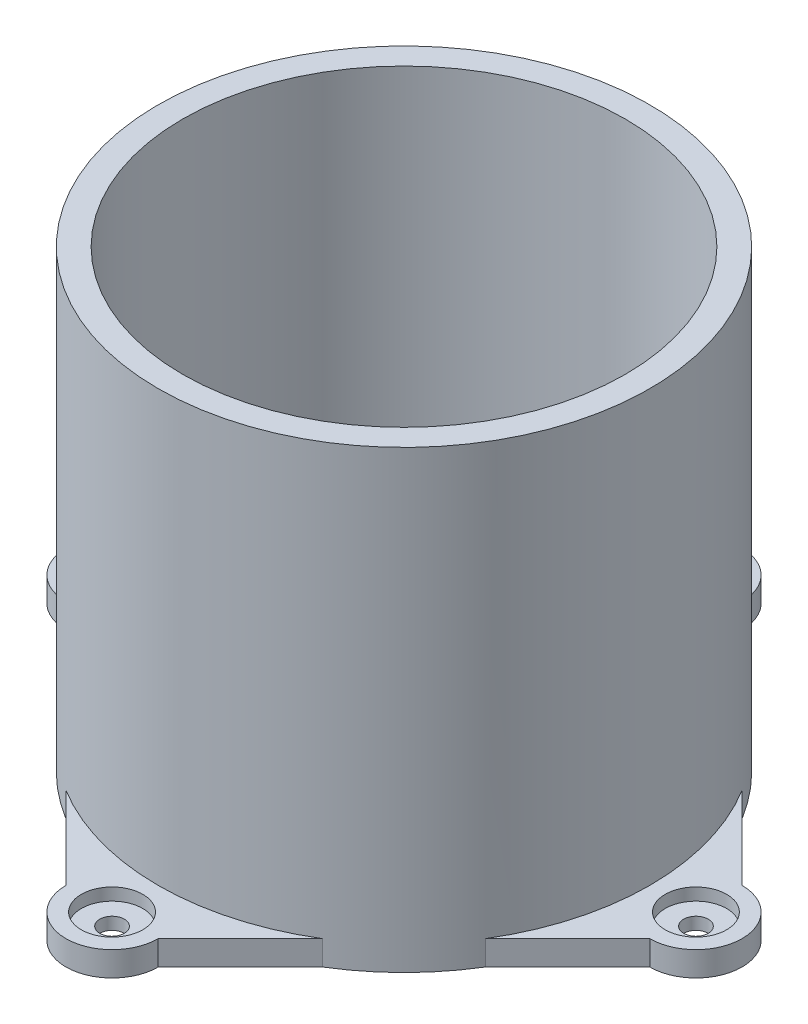
ISO-10303-21;
HEADER;
FILE_DESCRIPTION(('STEP AP214'),'2;1');
FILE_NAME('part.step','',(''),(''),'','','');
FILE_SCHEMA(('AUTOMOTIVE_DESIGN { 1 0 10303 214 1 1 1 1 }'));
ENDSEC;
DATA;
#1=APPLICATION_CONTEXT('core data for automotive mechanical design processes');
#2=APPLICATION_PROTOCOL_DEFINITION('international standard','automotive_design',2000,#1);
#3=PRODUCT_CONTEXT('',#1,'mechanical');
#4=PRODUCT('Part','Part','',(#3));
#5=PRODUCT_RELATED_PRODUCT_CATEGORY('part','',(#4));
#6=PRODUCT_DEFINITION_FORMATION('','',#4);
#7=PRODUCT_DEFINITION_CONTEXT('part definition',#1,'design');
#8=PRODUCT_DEFINITION('design','',#6,#7);
#9=PRODUCT_DEFINITION_SHAPE('','',#8);
#10=(LENGTH_UNIT() NAMED_UNIT(*) SI_UNIT(.MILLI.,.METRE.));
#11=(NAMED_UNIT(*) PLANE_ANGLE_UNIT() SI_UNIT($,.RADIAN.));
#12=(NAMED_UNIT(*) SI_UNIT($,.STERADIAN.) SOLID_ANGLE_UNIT());
#13=UNCERTAINTY_MEASURE_WITH_UNIT(LENGTH_MEASURE(1.E-05),#10,'distance_accuracy_value','');
#14=(GEOMETRIC_REPRESENTATION_CONTEXT(3) GLOBAL_UNCERTAINTY_ASSIGNED_CONTEXT((#13)) GLOBAL_UNIT_ASSIGNED_CONTEXT((#10,
#11,#12)) REPRESENTATION_CONTEXT('',''));
#15=CARTESIAN_POINT('',(0.,0.,0.));
#16=DIRECTION('',(0.,0.,1.));
#17=DIRECTION('',(1.,0.,0.));
#18=AXIS2_PLACEMENT_3D('',#15,#16,#17);
#19=CARTESIAN_POINT('',(0.,4.,0.));
#20=DIRECTION('',(0.,1.,0.));
#21=DIRECTION('',(0.,0.,1.));
#22=AXIS2_PLACEMENT_3D('',#19,#20,#21);
#23=PLANE('',#22);
#24=CARTESIAN_POINT('',(0.,4.,0.));
#25=DIRECTION('',(0.,1.,0.));
#26=DIRECTION('',(0.,0.,1.));
#27=AXIS2_PLACEMENT_3D('',#24,#25,#26);
#28=CIRCLE('',#27,40.);
#29=CARTESIAN_POINT('',(34.1143782776613,4.,20.8856217223389));
#30=VERTEX_POINT('',#29);
#31=CARTESIAN_POINT('',(34.1143782776619,4.,-20.8856217223379));
#32=VERTEX_POINT('',#31);
#33=EDGE_CURVE('E11',#30,#32,#28,.T.);
#34=ORIENTED_EDGE('',*,*,#33,.F.);
#35=DIRECTION('',(0.707106781186553,0.,-0.707106781186542));
#36=VECTOR('',#35,1.);
#37=CARTESIAN_POINT('',(47.5,4.,7.50000000000033));
#38=LINE('',#37,#36);
#39=CARTESIAN_POINT('',(47.5,4.,7.50000000000033));
#40=VERTEX_POINT('',#39);
#41=EDGE_CURVE('E292',#30,#40,#38,.T.);
#42=ORIENTED_EDGE('',*,*,#41,.T.);
#43=CARTESIAN_POINT('',(47.5,4.,3.30772242090737E-13));
#44=DIRECTION('',(0.,1.,0.));
#45=DIRECTION('',(0.,0.,1.));
#46=AXIS2_PLACEMENT_3D('',#43,#44,#45);
#47=CIRCLE('',#46,7.5);
#48=CARTESIAN_POINT('',(47.5,4.,-7.49999999999967));
#49=VERTEX_POINT('',#48);
#50=EDGE_CURVE('E294',#40,#49,#47,.T.);
#51=ORIENTED_EDGE('',*,*,#50,.T.);
#52=DIRECTION('',(-0.707106781186545,0.,-0.70710678118655));
#53=VECTOR('',#52,1.);
#54=CARTESIAN_POINT('',(34.1143782776619,4.,-20.8856217223379));
#55=LINE('',#54,#53);
#56=EDGE_CURVE('E170',#49,#32,#55,.T.);
#57=ORIENTED_EDGE('',*,*,#56,.T.);
#58=EDGE_LOOP('',(#34,#42,#51,#57));
#59=FACE_BOUND('',#58,.T.);
#60=CARTESIAN_POINT('',(47.5,4.,3.30772242090737E-13));
#61=DIRECTION('',(0.,1.,0.));
#62=DIRECTION('',(0.,0.,1.));
#63=AXIS2_PLACEMENT_3D('',#60,#61,#62);
#64=CIRCLE('',#63,5.);
#65=CARTESIAN_POINT('',(47.5,4.,5.00000000000033));
#66=VERTEX_POINT('',#65);
#67=EDGE_CURVE('E336',#66,#66,#64,.T.);
#68=ORIENTED_EDGE('',*,*,#67,.F.);
#69=EDGE_LOOP('',(#68));
#70=FACE_BOUND('',#69,.T.);
#71=ADVANCED_FACE('F37',(#59,#70),#23,.T.);
#72=CARTESIAN_POINT('',(20.8856217223381,4.,-34.1143782776617));
#73=VERTEX_POINT('',#72);
#74=CARTESIAN_POINT('',(-20.8856217223382,4.,-34.1143782776617));
#75=VERTEX_POINT('',#74);
#76=EDGE_CURVE('E47',#73,#75,#28,.T.);
#77=ORIENTED_EDGE('',*,*,#76,.F.);
#78=DIRECTION('',(-0.707106781186539,0.,-0.707106781186556));
#79=VECTOR('',#78,1.);
#80=CARTESIAN_POINT('',(7.50000000000016,4.,-47.5));
#81=LINE('',#80,#79);
#82=CARTESIAN_POINT('',(7.50000000000016,4.,-47.5));
#83=VERTEX_POINT('',#82);
#84=EDGE_CURVE('E160',#73,#83,#81,.T.);
#85=ORIENTED_EDGE('',*,*,#84,.T.);
#86=CARTESIAN_POINT('',(1.64926878495688E-13,4.,-47.5));
#87=DIRECTION('',(0.,1.,0.));
#88=DIRECTION('',(0.,0.,1.));
#89=AXIS2_PLACEMENT_3D('',#86,#87,#88);
#90=CIRCLE('',#89,7.5);
#91=CARTESIAN_POINT('',(-7.49999999999983,4.,-47.5));
#92=VERTEX_POINT('',#91);
#93=EDGE_CURVE('E165',#83,#92,#90,.T.);
#94=ORIENTED_EDGE('',*,*,#93,.T.);
#95=DIRECTION('',(-0.707106781186548,0.,0.707106781186547));
#96=VECTOR('',#95,1.);
#97=CARTESIAN_POINT('',(-20.8856217223382,4.,-34.1143782776617));
#98=LINE('',#97,#96);
#99=EDGE_CURVE('E57',#92,#75,#98,.T.);
#100=ORIENTED_EDGE('',*,*,#99,.T.);
#101=EDGE_LOOP('',(#77,#85,#94,#100));
#102=FACE_BOUND('',#101,.T.);
#103=CARTESIAN_POINT('',(1.64926878495688E-13,4.,-47.5));
#104=DIRECTION('',(0.,1.,0.));
#105=DIRECTION('',(0.,0.,1.));
#106=AXIS2_PLACEMENT_3D('',#103,#104,#105);
#107=CIRCLE('',#106,5.00000000000001);
#108=CARTESIAN_POINT('',(1.64926878495688E-13,4.,-42.5));
#109=VERTEX_POINT('',#108);
#110=EDGE_CURVE('E330',#109,#109,#107,.T.);
#111=ORIENTED_EDGE('',*,*,#110,.F.);
#112=EDGE_LOOP('',(#111));
#113=FACE_BOUND('',#112,.T.);
#114=ADVANCED_FACE('F162',(#102,#113),#23,.T.);
#115=CARTESIAN_POINT('',(-34.1143782776616,4.,-20.8856217223384));
#116=VERTEX_POINT('',#115);
#117=CARTESIAN_POINT('',(-34.1143782776612,4.,20.8856217223389));
#118=VERTEX_POINT('',#117);
#119=EDGE_CURVE('E126',#116,#118,#28,.T.);
#120=ORIENTED_EDGE('',*,*,#119,.F.);
#121=DIRECTION('',(-0.707106781186549,0.,0.707106781186546));
#122=VECTOR('',#121,1.);
#123=CARTESIAN_POINT('',(-47.5,4.,-7.5));
#124=LINE('',#123,#122);
#125=CARTESIAN_POINT('',(-47.5,4.,-7.5));
#126=VERTEX_POINT('',#125);
#127=EDGE_CURVE('E216',#116,#126,#124,.T.);
#128=ORIENTED_EDGE('',*,*,#127,.T.);
#129=CARTESIAN_POINT('',(-47.5,4.,0.));
#130=DIRECTION('',(0.,1.,0.));
#131=DIRECTION('',(0.,0.,1.));
#132=AXIS2_PLACEMENT_3D('',#129,#130,#131);
#133=CIRCLE('',#132,7.5);
#134=CARTESIAN_POINT('',(-47.5,4.,7.5));
#135=VERTEX_POINT('',#134);
#136=EDGE_CURVE('E281',#126,#135,#133,.T.);
#137=ORIENTED_EDGE('',*,*,#136,.T.);
#138=DIRECTION('',(0.707106781186543,0.,0.707106781186552));
#139=VECTOR('',#138,1.);
#140=CARTESIAN_POINT('',(-34.1143782776612,4.,20.8856217223389));
#141=LINE('',#140,#139);
#142=EDGE_CURVE('E283',#135,#118,#141,.T.);
#143=ORIENTED_EDGE('',*,*,#142,.T.);
#144=EDGE_LOOP('',(#120,#128,#137,#143));
#145=FACE_BOUND('',#144,.T.);
#146=CARTESIAN_POINT('',(-47.5,4.,0.));
#147=DIRECTION('',(0.,1.,0.));
#148=DIRECTION('',(0.,0.,1.));
#149=AXIS2_PLACEMENT_3D('',#146,#147,#148);
#150=CIRCLE('',#149,5.);
#151=CARTESIAN_POINT('',(-47.5,4.,5.00000000000001));
#152=VERTEX_POINT('',#151);
#153=EDGE_CURVE('E327',#152,#152,#150,.T.);
#154=ORIENTED_EDGE('',*,*,#153,.F.);
#155=EDGE_LOOP('',(#154));
#156=FACE_BOUND('',#155,.T.);
#157=ADVANCED_FACE('F385',(#145,#156),#23,.T.);
#158=CARTESIAN_POINT('',(-4.96617605685786E-13,0.,47.5));
#159=DIRECTION('',(0.,1.,0.));
#160=DIRECTION('',(0.,0.,1.));
#161=AXIS2_PLACEMENT_3D('',#158,#159,#160);
#162=CYLINDRICAL_SURFACE('',#161,2.);
#163=CARTESIAN_POINT('',(-4.96617605685786E-13,0.,47.5));
#164=DIRECTION('',(0.,1.,0.));
#165=DIRECTION('',(0.,0.,1.));
#166=AXIS2_PLACEMENT_3D('',#163,#164,#165);
#167=CIRCLE('',#166,2.);
#168=CARTESIAN_POINT('',(-4.96617605685786E-13,0.,49.5));
#169=VERTEX_POINT('',#168);
#170=EDGE_CURVE('E267',#169,#169,#167,.T.);
#171=ORIENTED_EDGE('',*,*,#170,.F.);
#172=EDGE_LOOP('',(#171));
#173=FACE_BOUND('',#172,.T.);
#174=CARTESIAN_POINT('',(-4.96617605685786E-13,2.,47.5));
#175=DIRECTION('',(0.,1.,0.));
#176=DIRECTION('',(0.,0.,1.));
#177=AXIS2_PLACEMENT_3D('',#174,#175,#176);
#178=CIRCLE('',#177,2.);
#179=CARTESIAN_POINT('',(-4.96617605685786E-13,2.,49.5));
#180=VERTEX_POINT('',#179);
#181=EDGE_CURVE('E41',#180,#180,#178,.F.);
#182=ORIENTED_EDGE('',*,*,#181,.F.);
#183=EDGE_LOOP('',(#182));
#184=FACE_BOUND('',#183,.T.);
#185=ADVANCED_FACE('F410',(#173,#184),#162,.F.);
#186=CARTESIAN_POINT('',(47.5,0.,3.30772242090737E-13));
#187=DIRECTION('',(0.,1.,0.));
#188=DIRECTION('',(0.,0.,1.));
#189=AXIS2_PLACEMENT_3D('',#186,#187,#188);
#190=CYLINDRICAL_SURFACE('',#189,2.);
#191=CARTESIAN_POINT('',(47.5,0.,3.30772242090737E-13));
#192=DIRECTION('',(0.,1.,0.));
#193=DIRECTION('',(0.,0.,1.));
#194=AXIS2_PLACEMENT_3D('',#191,#192,#193);
#195=CIRCLE('',#194,2.);
#196=CARTESIAN_POINT('',(47.5,0.,2.00000000000033));
#197=VERTEX_POINT('',#196);
#198=EDGE_CURVE('E271',#197,#197,#195,.T.);
#199=ORIENTED_EDGE('',*,*,#198,.F.);
#200=EDGE_LOOP('',(#199));
#201=FACE_BOUND('',#200,.T.);
#202=CARTESIAN_POINT('',(47.5,2.,3.30772242090737E-13));
#203=DIRECTION('',(0.,1.,0.));
#204=DIRECTION('',(0.,0.,1.));
#205=AXIS2_PLACEMENT_3D('',#202,#203,#204);
#206=CIRCLE('',#205,2.);
#207=CARTESIAN_POINT('',(47.5,2.,2.00000000000033));
#208=VERTEX_POINT('',#207);
#209=EDGE_CURVE('E262',#208,#208,#206,.F.);
#210=ORIENTED_EDGE('',*,*,#209,.F.);
#211=EDGE_LOOP('',(#210));
#212=FACE_BOUND('',#211,.T.);
#213=ADVANCED_FACE('F358',(#201,#212),#190,.F.);
#214=CARTESIAN_POINT('',(1.64926878495688E-13,0.,-47.5));
#215=DIRECTION('',(0.,1.,0.));
#216=DIRECTION('',(0.,0.,1.));
#217=AXIS2_PLACEMENT_3D('',#214,#215,#216);
#218=CYLINDRICAL_SURFACE('',#217,2.);
#219=CARTESIAN_POINT('',(1.64926878495688E-13,0.,-47.5));
#220=DIRECTION('',(0.,1.,0.));
#221=DIRECTION('',(0.,0.,1.));
#222=AXIS2_PLACEMENT_3D('',#219,#220,#221);
#223=CIRCLE('',#222,2.);
#224=CARTESIAN_POINT('',(1.64926878495688E-13,0.,-45.5));
#225=VERTEX_POINT('',#224);
#226=EDGE_CURVE('E276',#225,#225,#223,.T.);
#227=ORIENTED_EDGE('',*,*,#226,.F.);
#228=EDGE_LOOP('',(#227));
#229=FACE_BOUND('',#228,.T.);
#230=CARTESIAN_POINT('',(1.64926878495688E-13,2.,-47.5));
#231=DIRECTION('',(0.,1.,0.));
#232=DIRECTION('',(0.,0.,1.));
#233=AXIS2_PLACEMENT_3D('',#230,#231,#232);
#234=CIRCLE('',#233,2.);
#235=CARTESIAN_POINT('',(1.64926878495688E-13,2.,-45.5));
#236=VERTEX_POINT('',#235);
#237=EDGE_CURVE('E259',#236,#236,#234,.F.);
#238=ORIENTED_EDGE('',*,*,#237,.F.);
#239=EDGE_LOOP('',(#238));
#240=FACE_BOUND('',#239,.T.);
#241=ADVANCED_FACE('F354',(#229,#240),#218,.F.);
#242=CARTESIAN_POINT('',(-47.5,0.,0.));
#243=DIRECTION('',(0.,1.,0.));
#244=DIRECTION('',(0.,0.,1.));
#245=AXIS2_PLACEMENT_3D('',#242,#243,#244);
#246=CYLINDRICAL_SURFACE('',#245,2.);
#247=CARTESIAN_POINT('',(-47.5,0.,0.));
#248=DIRECTION('',(0.,1.,0.));
#249=DIRECTION('',(0.,0.,1.));
#250=AXIS2_PLACEMENT_3D('',#247,#248,#249);
#251=CIRCLE('',#250,2.);
#252=CARTESIAN_POINT('',(-47.5,0.,2.));
#253=VERTEX_POINT('',#252);
#254=EDGE_CURVE('E189',#253,#253,#251,.T.);
#255=ORIENTED_EDGE('',*,*,#254,.F.);
#256=EDGE_LOOP('',(#255));
#257=FACE_BOUND('',#256,.T.);
#258=CARTESIAN_POINT('',(-47.5,2.,0.));
#259=DIRECTION('',(0.,1.,0.));
#260=DIRECTION('',(0.,0.,1.));
#261=AXIS2_PLACEMENT_3D('',#258,#259,#260);
#262=CIRCLE('',#261,2.);
#263=CARTESIAN_POINT('',(-47.5,2.,2.));
#264=VERTEX_POINT('',#263);
#265=EDGE_CURVE('E256',#264,#264,#262,.F.);
#266=ORIENTED_EDGE('',*,*,#265,.F.);
#267=EDGE_LOOP('',(#266));
#268=FACE_BOUND('',#267,.T.);
#269=ADVANCED_FACE('F357',(#257,#268),#246,.F.);
#270=CARTESIAN_POINT('',(-47.5,4.,-7.5));
#271=DIRECTION('',(0.707106781186546,0.,0.707106781186549));
#272=DIRECTION('',(0.707106781186549,0.,-0.707106781186546));
#273=AXIS2_PLACEMENT_3D('',#270,#271,#272);
#274=PLANE('',#273);
#275=DIRECTION('',(-0.707106781186549,0.,0.707106781186546));
#276=VECTOR('',#275,1.);
#277=CARTESIAN_POINT('',(-47.5,0.,-7.5));
#278=LINE('',#277,#276);
#279=CARTESIAN_POINT('',(-34.1143782776616,0.,-20.8856217223384));
#280=VERTEX_POINT('',#279);
#281=CARTESIAN_POINT('',(-47.5,0.,-7.5));
#282=VERTEX_POINT('',#281);
#283=EDGE_CURVE('E188',#280,#282,#278,.T.);
#284=ORIENTED_EDGE('',*,*,#283,.T.);
#285=DIRECTION('',(0.,-1.,0.));
#286=VECTOR('',#285,1.);
#287=CARTESIAN_POINT('',(-47.5,4.,-7.5));
#288=LINE('',#287,#286);
#289=EDGE_CURVE('E250',#126,#282,#288,.T.);
#290=ORIENTED_EDGE('',*,*,#289,.F.);
#291=ORIENTED_EDGE('',*,*,#127,.F.);
#292=DIRECTION('',(0.,-1.,0.));
#293=VECTOR('',#292,1.);
#294=CARTESIAN_POINT('',(-34.1143782776616,4.,-20.8856217223384));
#295=LINE('',#294,#293);
#296=EDGE_CURVE('E253',#116,#280,#295,.T.);
#297=ORIENTED_EDGE('',*,*,#296,.T.);
#298=EDGE_LOOP('',(#284,#290,#291,#297));
#299=FACE_BOUND('',#298,.T.);
#300=ADVANCED_FACE('F39',(#299),#274,.F.);
#301=CARTESIAN_POINT('',(-47.5,4.,0.));
#302=DIRECTION('',(0.,-1.,0.));
#303=DIRECTION('',(0.,0.,-1.));
#304=AXIS2_PLACEMENT_3D('',#301,#302,#303);
#305=CYLINDRICAL_SURFACE('',#304,7.5);
#306=CARTESIAN_POINT('',(-47.5,0.,0.));
#307=DIRECTION('',(0.,1.,0.));
#308=DIRECTION('',(0.,0.,1.));
#309=AXIS2_PLACEMENT_3D('',#306,#307,#308);
#310=CIRCLE('',#309,7.5);
#311=CARTESIAN_POINT('',(-47.5,0.,7.5));
#312=VERTEX_POINT('',#311);
#313=EDGE_CURVE('E191',#282,#312,#310,.T.);
#314=ORIENTED_EDGE('',*,*,#313,.T.);
#315=DIRECTION('',(0.,-1.,0.));
#316=VECTOR('',#315,1.);
#317=CARTESIAN_POINT('',(-47.5,4.,7.5));
#318=LINE('',#317,#316);
#319=EDGE_CURVE('E247',#135,#312,#318,.T.);
#320=ORIENTED_EDGE('',*,*,#319,.F.);
#321=ORIENTED_EDGE('',*,*,#136,.F.);
#322=ORIENTED_EDGE('',*,*,#289,.T.);
#323=EDGE_LOOP('',(#314,#320,#321,#322));
#324=FACE_BOUND('',#323,.T.);
#325=ADVANCED_FACE('F638',(#324),#305,.T.);
#326=CARTESIAN_POINT('',(-34.1143782776612,4.,20.8856217223389));
#327=DIRECTION('',(0.707106781186552,0.,-0.707106781186543));
#328=DIRECTION('',(-0.707106781186543,0.,-0.707106781186552));
#329=AXIS2_PLACEMENT_3D('',#326,#327,#328);
#330=PLANE('',#329);
#331=DIRECTION('',(0.707106781186543,0.,0.707106781186552));
#332=VECTOR('',#331,1.);
#333=CARTESIAN_POINT('',(-34.1143782776612,0.,20.8856217223389));
#334=LINE('',#333,#332);
#335=CARTESIAN_POINT('',(-34.1143782776612,0.,20.8856217223389));
#336=VERTEX_POINT('',#335);
#337=EDGE_CURVE('E193',#312,#336,#334,.T.);
#338=ORIENTED_EDGE('',*,*,#337,.T.);
#339=DIRECTION('',(0.,-1.,0.));
#340=VECTOR('',#339,1.);
#341=CARTESIAN_POINT('',(-34.1143782776612,4.,20.8856217223389));
#342=LINE('',#341,#340);
#343=EDGE_CURVE('E244',#118,#336,#342,.T.);
#344=ORIENTED_EDGE('',*,*,#343,.F.);
#345=ORIENTED_EDGE('',*,*,#142,.F.);
#346=ORIENTED_EDGE('',*,*,#319,.T.);
#347=EDGE_LOOP('',(#338,#344,#345,#346));
#348=FACE_BOUND('',#347,.T.);
#349=ADVANCED_FACE('F646',(#348),#330,.F.);
#350=CARTESIAN_POINT('',(-7.50000000000018,4.,47.5000000000002));
#351=DIRECTION('',(0.70710678118655,0.,-0.707106781186545));
#352=DIRECTION('',(-0.707106781186545,0.,-0.70710678118655));
#353=AXIS2_PLACEMENT_3D('',#350,#351,#352);
#354=PLANE('',#353);
#355=DIRECTION('',(0.707106781186545,0.,0.70710678118655));
#356=VECTOR('',#355,1.);
#357=CARTESIAN_POINT('',(-7.50000000000018,0.,47.5000000000002));
#358=LINE('',#357,#356);
#359=CARTESIAN_POINT('',(-20.8856217223391,0.,34.1143782776611));
#360=VERTEX_POINT('',#359);
#361=CARTESIAN_POINT('',(-7.50000000000018,0.,47.5000000000002));
#362=VERTEX_POINT('',#361);
#363=EDGE_CURVE('E197',#360,#362,#358,.T.);
#364=ORIENTED_EDGE('',*,*,#363,.T.);
#365=DIRECTION('',(0.,-1.,0.));
#366=VECTOR('',#365,1.);
#367=CARTESIAN_POINT('',(-7.50000000000018,4.,47.5000000000002));
#368=LINE('',#367,#366);
#369=CARTESIAN_POINT('',(-7.50000000000018,4.,47.5000000000002));
#370=VERTEX_POINT('',#369);
#371=EDGE_CURVE('E238',#370,#362,#368,.T.);
#372=ORIENTED_EDGE('',*,*,#371,.F.);
#373=DIRECTION('',(0.707106781186545,0.,0.70710678118655));
#374=VECTOR('',#373,1.);
#375=CARTESIAN_POINT('',(-7.50000000000018,4.,47.5000000000002));
#376=LINE('',#375,#374);
#377=CARTESIAN_POINT('',(-20.8856217223391,4.,34.1143782776611));
#378=VERTEX_POINT('',#377);
#379=EDGE_CURVE('E285',#378,#370,#376,.T.);
#380=ORIENTED_EDGE('',*,*,#379,.F.);
#381=DIRECTION('',(0.,-1.,0.));
#382=VECTOR('',#381,1.);
#383=CARTESIAN_POINT('',(-20.8856217223391,4.,34.1143782776611));
#384=LINE('',#383,#382);
#385=EDGE_CURVE('E241',#378,#360,#384,.T.);
#386=ORIENTED_EDGE('',*,*,#385,.T.);
#387=EDGE_LOOP('',(#364,#372,#380,#386));
#388=FACE_BOUND('',#387,.T.);
#389=ADVANCED_FACE('F653',(#388),#354,.F.);
#390=CARTESIAN_POINT('',(-4.96617605685786E-13,4.,47.5));
#391=DIRECTION('',(0.,-1.,0.));
#392=DIRECTION('',(0.,0.,-1.));
#393=AXIS2_PLACEMENT_3D('',#390,#391,#392);
#394=CYLINDRICAL_SURFACE('',#393,7.49999999999984);
#395=CARTESIAN_POINT('',(-4.96617605685786E-13,0.,47.5));
#396=DIRECTION('',(0.,1.,0.));
#397=DIRECTION('',(0.,0.,1.));
#398=AXIS2_PLACEMENT_3D('',#395,#396,#397);
#399=CIRCLE('',#398,7.49999999999984);
#400=CARTESIAN_POINT('',(7.49999999999934,0.,47.5));
#401=VERTEX_POINT('',#400);
#402=EDGE_CURVE('E199',#362,#401,#399,.T.);
#403=ORIENTED_EDGE('',*,*,#402,.T.);
#404=DIRECTION('',(0.,-1.,0.));
#405=VECTOR('',#404,1.);
#406=CARTESIAN_POINT('',(7.49999999999934,4.,47.5));
#407=LINE('',#406,#405);
#408=CARTESIAN_POINT('',(7.49999999999934,4.,47.5));
#409=VERTEX_POINT('',#408);
#410=EDGE_CURVE('E235',#409,#401,#407,.T.);
#411=ORIENTED_EDGE('',*,*,#410,.F.);
#412=CARTESIAN_POINT('',(-4.96617605685786E-13,4.,47.5));
#413=DIRECTION('',(0.,1.,0.));
#414=DIRECTION('',(0.,0.,1.));
#415=AXIS2_PLACEMENT_3D('',#412,#413,#414);
#416=CIRCLE('',#415,7.49999999999984);
#417=EDGE_CURVE('E287',#370,#409,#416,.T.);
#418=ORIENTED_EDGE('',*,*,#417,.F.);
#419=ORIENTED_EDGE('',*,*,#371,.T.);
#420=EDGE_LOOP('',(#403,#411,#418,#419));
#421=FACE_BOUND('',#420,.T.);
#422=ADVANCED_FACE('F661',(#421),#394,.T.);
#423=CARTESIAN_POINT('',(20.8856217223386,4.,34.1143782776614));
#424=DIRECTION('',(-0.707106781186534,0.,-0.707106781186561));
#425=DIRECTION('',(-0.707106781186561,0.,0.707106781186534));
#426=AXIS2_PLACEMENT_3D('',#423,#424,#425);
#427=PLANE('',#426);
#428=DIRECTION('',(0.707106781186561,0.,-0.707106781186534));
#429=VECTOR('',#428,1.);
#430=CARTESIAN_POINT('',(20.8856217223386,0.,34.1143782776614));
#431=LINE('',#430,#429);
#432=CARTESIAN_POINT('',(20.8856217223386,0.,34.1143782776614));
#433=VERTEX_POINT('',#432);
#434=EDGE_CURVE('E201',#401,#433,#431,.T.);
#435=ORIENTED_EDGE('',*,*,#434,.T.);
#436=DIRECTION('',(0.,-1.,0.));
#437=VECTOR('',#436,1.);
#438=CARTESIAN_POINT('',(20.8856217223386,4.,34.1143782776614));
#439=LINE('',#438,#437);
#440=CARTESIAN_POINT('',(20.8856217223386,4.,34.1143782776614));
#441=VERTEX_POINT('',#440);
#442=EDGE_CURVE('E232',#441,#433,#439,.T.);
#443=ORIENTED_EDGE('',*,*,#442,.F.);
#444=DIRECTION('',(0.707106781186561,0.,-0.707106781186534));
#445=VECTOR('',#444,1.);
#446=CARTESIAN_POINT('',(20.8856217223386,4.,34.1143782776614));
#447=LINE('',#446,#445);
#448=EDGE_CURVE('E289',#409,#441,#447,.T.);
#449=ORIENTED_EDGE('',*,*,#448,.F.);
#450=ORIENTED_EDGE('',*,*,#410,.T.);
#451=EDGE_LOOP('',(#435,#443,#449,#450));
#452=FACE_BOUND('',#451,.T.);
#453=ADVANCED_FACE('F668',(#452),#427,.F.);
#454=CARTESIAN_POINT('',(47.5,4.,7.50000000000033));
#455=DIRECTION('',(-0.707106781186542,0.,-0.707106781186553));
#456=DIRECTION('',(-0.707106781186553,0.,0.707106781186542));
#457=AXIS2_PLACEMENT_3D('',#454,#455,#456);
#458=PLANE('',#457);
#459=DIRECTION('',(0.707106781186553,0.,-0.707106781186542));
#460=VECTOR('',#459,1.);
#461=CARTESIAN_POINT('',(47.5,0.,7.50000000000033));
#462=LINE('',#461,#460);
#463=CARTESIAN_POINT('',(34.1143782776613,0.,20.8856217223389));
#464=VERTEX_POINT('',#463);
#465=CARTESIAN_POINT('',(47.5,0.,7.50000000000033));
#466=VERTEX_POINT('',#465);
#467=EDGE_CURVE('E205',#464,#466,#462,.T.);
#468=ORIENTED_EDGE('',*,*,#467,.T.);
#469=DIRECTION('',(0.,-1.,0.));
#470=VECTOR('',#469,1.);
#471=CARTESIAN_POINT('',(47.5,4.,7.50000000000033));
#472=LINE('',#471,#470);
#473=EDGE_CURVE('E226',#40,#466,#472,.T.);
#474=ORIENTED_EDGE('',*,*,#473,.F.);
#475=ORIENTED_EDGE('',*,*,#41,.F.);
#476=DIRECTION('',(0.,-1.,0.));
#477=VECTOR('',#476,1.);
#478=CARTESIAN_POINT('',(34.1143782776613,4.,20.8856217223389));
#479=LINE('',#478,#477);
#480=EDGE_CURVE('E229',#30,#464,#479,.T.);
#481=ORIENTED_EDGE('',*,*,#480,.T.);
#482=EDGE_LOOP('',(#468,#474,#475,#481));
#483=FACE_BOUND('',#482,.T.);
#484=ADVANCED_FACE('F314',(#483),#458,.F.);
#485=CARTESIAN_POINT('',(47.5,4.,3.30772242090737E-13));
#486=DIRECTION('',(0.,-1.,0.));
#487=DIRECTION('',(0.,0.,-1.));
#488=AXIS2_PLACEMENT_3D('',#485,#486,#487);
#489=CYLINDRICAL_SURFACE('',#488,7.5);
#490=CARTESIAN_POINT('',(47.5,0.,3.30772242090737E-13));
#491=DIRECTION('',(0.,1.,0.));
#492=DIRECTION('',(0.,0.,1.));
#493=AXIS2_PLACEMENT_3D('',#490,#491,#492);
#494=CIRCLE('',#493,7.5);
#495=CARTESIAN_POINT('',(47.5,0.,-7.49999999999967));
#496=VERTEX_POINT('',#495);
#497=EDGE_CURVE('E207',#466,#496,#494,.T.);
#498=ORIENTED_EDGE('',*,*,#497,.T.);
#499=DIRECTION('',(0.,-1.,0.));
#500=VECTOR('',#499,1.);
#501=CARTESIAN_POINT('',(47.5,4.,-7.49999999999967));
#502=LINE('',#501,#500);
#503=EDGE_CURVE('E223',#49,#496,#502,.T.);
#504=ORIENTED_EDGE('',*,*,#503,.F.);
#505=ORIENTED_EDGE('',*,*,#50,.F.);
#506=ORIENTED_EDGE('',*,*,#473,.T.);
#507=EDGE_LOOP('',(#498,#504,#505,#506));
#508=FACE_BOUND('',#507,.T.);
#509=ADVANCED_FACE('F317',(#508),#489,.T.);
#510=CARTESIAN_POINT('',(34.1143782776619,4.,-20.8856217223379));
#511=DIRECTION('',(-0.70710678118655,0.,0.707106781186545));
#512=DIRECTION('',(0.707106781186545,0.,0.70710678118655));
#513=AXIS2_PLACEMENT_3D('',#510,#511,#512);
#514=PLANE('',#513);
#515=DIRECTION('',(-0.707106781186545,0.,-0.70710678118655));
#516=VECTOR('',#515,1.);
#517=CARTESIAN_POINT('',(34.1143782776619,0.,-20.8856217223379));
#518=LINE('',#517,#516);
#519=CARTESIAN_POINT('',(34.1143782776619,0.,-20.8856217223379));
#520=VERTEX_POINT('',#519);
#521=EDGE_CURVE('E209',#496,#520,#518,.T.);
#522=ORIENTED_EDGE('',*,*,#521,.T.);
#523=DIRECTION('',(0.,-1.,0.));
#524=VECTOR('',#523,1.);
#525=CARTESIAN_POINT('',(34.1143782776619,4.,-20.8856217223379));
#526=LINE('',#525,#524);
#527=EDGE_CURVE('E220',#32,#520,#526,.T.);
#528=ORIENTED_EDGE('',*,*,#527,.F.);
#529=ORIENTED_EDGE('',*,*,#56,.F.);
#530=ORIENTED_EDGE('',*,*,#503,.T.);
#531=EDGE_LOOP('',(#522,#528,#529,#530));
#532=FACE_BOUND('',#531,.T.);
#533=ADVANCED_FACE('F303',(#532),#514,.F.);
#534=CARTESIAN_POINT('',(0.,4.,0.));
#535=DIRECTION('',(0.,-1.,0.));
#536=DIRECTION('',(0.,0.,-1.));
#537=AXIS2_PLACEMENT_3D('',#534,#535,#536);
#538=CYLINDRICAL_SURFACE('',#537,40.);
#539=CARTESIAN_POINT('',(0.,0.,0.));
#540=DIRECTION('',(0.,1.,0.));
#541=DIRECTION('',(0.,0.,1.));
#542=AXIS2_PLACEMENT_3D('',#539,#540,#541);
#543=CIRCLE('',#542,40.);
#544=CARTESIAN_POINT('',(20.8856217223381,0.,-34.1143782776617));
#545=VERTEX_POINT('',#544);
#546=EDGE_CURVE('E211',#520,#545,#543,.T.);
#547=ORIENTED_EDGE('',*,*,#546,.T.);
#548=DIRECTION('',(0.,-1.,0.));
#549=VECTOR('',#548,1.);
#550=CARTESIAN_POINT('',(20.8856217223381,4.,-34.1143782776617));
#551=LINE('',#550,#549);
#552=EDGE_CURVE('E176',#73,#545,#551,.T.);
#553=ORIENTED_EDGE('',*,*,#552,.F.);
#554=ORIENTED_EDGE('',*,*,#76,.T.);
#555=DIRECTION('',(0.,-1.,0.));
#556=VECTOR('',#555,1.);
#557=CARTESIAN_POINT('',(-20.8856217223382,4.,-34.1143782776617));
#558=LINE('',#557,#556);
#559=CARTESIAN_POINT('',(-20.8856217223382,0.,-34.1143782776617));
#560=VERTEX_POINT('',#559);
#561=EDGE_CURVE('E181',#75,#560,#558,.T.);
#562=ORIENTED_EDGE('',*,*,#561,.T.);
#563=CARTESIAN_POINT('',(0.,0.,0.));
#564=DIRECTION('',(0.,1.,0.));
#565=DIRECTION('',(0.,0.,1.));
#566=AXIS2_PLACEMENT_3D('',#563,#564,#565);
#567=CIRCLE('',#566,40.);
#568=EDGE_CURVE('E185',#560,#280,#567,.T.);
#569=ORIENTED_EDGE('',*,*,#568,.T.);
#570=ORIENTED_EDGE('',*,*,#296,.F.);
#571=ORIENTED_EDGE('',*,*,#119,.T.);
#572=ORIENTED_EDGE('',*,*,#343,.T.);
#573=CARTESIAN_POINT('',(0.,0.,0.));
#574=DIRECTION('',(0.,1.,0.));
#575=DIRECTION('',(0.,0.,1.));
#576=AXIS2_PLACEMENT_3D('',#573,#574,#575);
#577=CIRCLE('',#576,40.);
#578=EDGE_CURVE('E195',#336,#360,#577,.T.);
#579=ORIENTED_EDGE('',*,*,#578,.T.);
#580=ORIENTED_EDGE('',*,*,#385,.F.);
#581=EDGE_CURVE('E49',#378,#441,#28,.T.);
#582=ORIENTED_EDGE('',*,*,#581,.T.);
#583=ORIENTED_EDGE('',*,*,#442,.T.);
#584=CARTESIAN_POINT('',(0.,0.,0.));
#585=DIRECTION('',(0.,1.,0.));
#586=DIRECTION('',(0.,0.,1.));
#587=AXIS2_PLACEMENT_3D('',#584,#585,#586);
#588=CIRCLE('',#587,40.);
#589=EDGE_CURVE('E203',#433,#464,#588,.T.);
#590=ORIENTED_EDGE('',*,*,#589,.T.);
#591=ORIENTED_EDGE('',*,*,#480,.F.);
#592=ORIENTED_EDGE('',*,*,#33,.T.);
#593=ORIENTED_EDGE('',*,*,#527,.T.);
#594=EDGE_LOOP('',(#547,#553,#554,#562,#569,#570,#571,#572,#579,#580,#582,#583,#590,#591,#592,#593));
#595=FACE_BOUND('',#594,.T.);
#596=CARTESIAN_POINT('',(0.,74.,0.));
#597=DIRECTION('',(0.,1.,0.));
#598=DIRECTION('',(0.,0.,1.));
#599=AXIS2_PLACEMENT_3D('',#596,#597,#598);
#600=CIRCLE('',#599,40.);
#601=CARTESIAN_POINT('',(0.,74.,40.));
#602=VERTEX_POINT('',#601);
#603=EDGE_CURVE('E323',#602,#602,#600,.T.);
#604=ORIENTED_EDGE('',*,*,#603,.F.);
#605=EDGE_LOOP('',(#604));
#606=FACE_BOUND('',#605,.T.);
#607=ADVANCED_FACE('F307',(#595,#606),#538,.T.);
#608=CARTESIAN_POINT('',(7.50000000000016,4.,-47.5));
#609=DIRECTION('',(-0.707106781186556,0.,0.707106781186539));
#610=DIRECTION('',(0.707106781186539,0.,0.707106781186556));
#611=AXIS2_PLACEMENT_3D('',#608,#609,#610);
#612=PLANE('',#611);
#613=DIRECTION('',(-0.707106781186539,0.,-0.707106781186556));
#614=VECTOR('',#613,1.);
#615=CARTESIAN_POINT('',(7.50000000000016,0.,-47.5));
#616=LINE('',#615,#614);
#617=CARTESIAN_POINT('',(7.50000000000016,0.,-47.5));
#618=VERTEX_POINT('',#617);
#619=EDGE_CURVE('E175',#545,#618,#616,.T.);
#620=ORIENTED_EDGE('',*,*,#619,.T.);
#621=DIRECTION('',(0.,-1.,0.));
#622=VECTOR('',#621,1.);
#623=CARTESIAN_POINT('',(7.50000000000016,4.,-47.5));
#624=LINE('',#623,#622);
#625=EDGE_CURVE('E172',#83,#618,#624,.T.);
#626=ORIENTED_EDGE('',*,*,#625,.F.);
#627=ORIENTED_EDGE('',*,*,#84,.F.);
#628=ORIENTED_EDGE('',*,*,#552,.T.);
#629=EDGE_LOOP('',(#620,#626,#627,#628));
#630=FACE_BOUND('',#629,.T.);
#631=ADVANCED_FACE('F173',(#630),#612,.F.);
#632=CARTESIAN_POINT('',(1.64926878495688E-13,4.,-47.5));
#633=DIRECTION('',(0.,-1.,0.));
#634=DIRECTION('',(0.,0.,-1.));
#635=AXIS2_PLACEMENT_3D('',#632,#633,#634);
#636=CYLINDRICAL_SURFACE('',#635,7.5);
#637=CARTESIAN_POINT('',(1.64926878495688E-13,0.,-47.5));
#638=DIRECTION('',(0.,1.,0.));
#639=DIRECTION('',(0.,0.,1.));
#640=AXIS2_PLACEMENT_3D('',#637,#638,#639);
#641=CIRCLE('',#640,7.5);
#642=CARTESIAN_POINT('',(-7.49999999999983,0.,-47.5));
#643=VERTEX_POINT('',#642);
#644=EDGE_CURVE('E111',#618,#643,#641,.T.);
#645=ORIENTED_EDGE('',*,*,#644,.T.);
#646=DIRECTION('',(0.,-1.,0.));
#647=VECTOR('',#646,1.);
#648=CARTESIAN_POINT('',(-7.49999999999983,4.,-47.5));
#649=LINE('',#648,#647);
#650=EDGE_CURVE('E177',#92,#643,#649,.T.);
#651=ORIENTED_EDGE('',*,*,#650,.F.);
#652=ORIENTED_EDGE('',*,*,#93,.F.);
#653=ORIENTED_EDGE('',*,*,#625,.T.);
#654=EDGE_LOOP('',(#645,#651,#652,#653));
#655=FACE_BOUND('',#654,.T.);
#656=ADVANCED_FACE('F179',(#655),#636,.T.);
#657=CARTESIAN_POINT('',(-20.8856217223382,4.,-34.1143782776617));
#658=DIRECTION('',(0.707106781186547,0.,0.707106781186548));
#659=DIRECTION('',(0.707106781186548,0.,-0.707106781186547));
#660=AXIS2_PLACEMENT_3D('',#657,#658,#659);
#661=PLANE('',#660);
#662=DIRECTION('',(-0.707106781186548,0.,0.707106781186547));
#663=VECTOR('',#662,1.);
#664=CARTESIAN_POINT('',(-20.8856217223382,0.,-34.1143782776617));
#665=LINE('',#664,#663);
#666=EDGE_CURVE('E117',#643,#560,#665,.T.);
#667=ORIENTED_EDGE('',*,*,#666,.T.);
#668=ORIENTED_EDGE('',*,*,#561,.F.);
#669=ORIENTED_EDGE('',*,*,#99,.F.);
#670=ORIENTED_EDGE('',*,*,#650,.T.);
#671=EDGE_LOOP('',(#667,#668,#669,#670));
#672=FACE_BOUND('',#671,.T.);
#673=ADVANCED_FACE('F389',(#672),#661,.F.);
#674=ORIENTED_EDGE('',*,*,#581,.F.);
#675=ORIENTED_EDGE('',*,*,#379,.T.);
#676=ORIENTED_EDGE('',*,*,#417,.T.);
#677=ORIENTED_EDGE('',*,*,#448,.T.);
#678=EDGE_LOOP('',(#674,#675,#676,#677));
#679=FACE_BOUND('',#678,.T.);
#680=CARTESIAN_POINT('',(-4.96617605685786E-13,4.,47.5));
#681=DIRECTION('',(0.,1.,0.));
#682=DIRECTION('',(0.,0.,1.));
#683=AXIS2_PLACEMENT_3D('',#680,#681,#682);
#684=CIRCLE('',#683,5.);
#685=CARTESIAN_POINT('',(-4.96617605685786E-13,4.,52.5));
#686=VERTEX_POINT('',#685);
#687=EDGE_CURVE('E342',#686,#686,#684,.T.);
#688=ORIENTED_EDGE('',*,*,#687,.F.);
#689=EDGE_LOOP('',(#688));
#690=FACE_BOUND('',#689,.T.);
#691=ADVANCED_FACE('F381',(#679,#690),#23,.T.);
#692=CARTESIAN_POINT('',(0.,0.,0.));
#693=DIRECTION('',(0.,1.,0.));
#694=DIRECTION('',(0.,0.,1.));
#695=AXIS2_PLACEMENT_3D('',#692,#693,#694);
#696=PLANE('',#695);
#697=ORIENTED_EDGE('',*,*,#254,.T.);
#698=EDGE_LOOP('',(#697));
#699=FACE_BOUND('',#698,.T.);
#700=ORIENTED_EDGE('',*,*,#226,.T.);
#701=EDGE_LOOP('',(#700));
#702=FACE_BOUND('',#701,.T.);
#703=ORIENTED_EDGE('',*,*,#198,.T.);
#704=EDGE_LOOP('',(#703));
#705=FACE_BOUND('',#704,.T.);
#706=ORIENTED_EDGE('',*,*,#170,.T.);
#707=EDGE_LOOP('',(#706));
#708=FACE_BOUND('',#707,.T.);
#709=ORIENTED_EDGE('',*,*,#568,.F.);
#710=ORIENTED_EDGE('',*,*,#666,.F.);
#711=ORIENTED_EDGE('',*,*,#644,.F.);
#712=ORIENTED_EDGE('',*,*,#619,.F.);
#713=ORIENTED_EDGE('',*,*,#546,.F.);
#714=ORIENTED_EDGE('',*,*,#521,.F.);
#715=ORIENTED_EDGE('',*,*,#497,.F.);
#716=ORIENTED_EDGE('',*,*,#467,.F.);
#717=ORIENTED_EDGE('',*,*,#589,.F.);
#718=ORIENTED_EDGE('',*,*,#434,.F.);
#719=ORIENTED_EDGE('',*,*,#402,.F.);
#720=ORIENTED_EDGE('',*,*,#363,.F.);
#721=ORIENTED_EDGE('',*,*,#578,.F.);
#722=ORIENTED_EDGE('',*,*,#337,.F.);
#723=ORIENTED_EDGE('',*,*,#313,.F.);
#724=ORIENTED_EDGE('',*,*,#283,.F.);
#725=EDGE_LOOP('',(#709,#710,#711,#712,#713,#714,#715,#716,#717,#718,#719,#720,#721,#722,#723,#724));
#726=FACE_BOUND('',#725,.T.);
#727=ADVANCED_FACE('F320',(#699,#702,#705,#708,#726),#696,.F.);
#728=CARTESIAN_POINT('',(-47.5,2.,0.));
#729=DIRECTION('',(0.,1.,0.));
#730=DIRECTION('',(0.,0.,1.));
#731=AXIS2_PLACEMENT_3D('',#728,#729,#730);
#732=PLANE('',#731);
#733=CARTESIAN_POINT('',(-47.5,2.,0.));
#734=DIRECTION('',(0.,1.,0.));
#735=DIRECTION('',(0.,0.,1.));
#736=AXIS2_PLACEMENT_3D('',#733,#734,#735);
#737=CIRCLE('',#736,5.);
#738=CARTESIAN_POINT('',(-47.5,2.,5.00000000000001));
#739=VERTEX_POINT('',#738);
#740=EDGE_CURVE('E260',#739,#739,#737,.T.);
#741=ORIENTED_EDGE('',*,*,#740,.T.);
#742=EDGE_LOOP('',(#741));
#743=FACE_BOUND('',#742,.T.);
#744=ORIENTED_EDGE('',*,*,#265,.T.);
#745=EDGE_LOOP('',(#744));
#746=FACE_BOUND('',#745,.T.);
#747=ADVANCED_FACE('F375',(#743,#746),#732,.T.);
#748=CARTESIAN_POINT('',(-47.5,2.,0.));
#749=DIRECTION('',(0.,1.,0.));
#750=DIRECTION('',(0.,0.,1.));
#751=AXIS2_PLACEMENT_3D('',#748,#749,#750);
#752=CYLINDRICAL_SURFACE('',#751,5.);
#753=ORIENTED_EDGE('',*,*,#740,.F.);
#754=EDGE_LOOP('',(#753));
#755=FACE_BOUND('',#754,.T.);
#756=ORIENTED_EDGE('',*,*,#153,.T.);
#757=EDGE_LOOP('',(#756));
#758=FACE_BOUND('',#757,.T.);
#759=ADVANCED_FACE('F365',(#755,#758),#752,.F.);
#760=CARTESIAN_POINT('',(1.64926878495688E-13,2.,-47.5));
#761=DIRECTION('',(0.,1.,0.));
#762=DIRECTION('',(0.,0.,1.));
#763=AXIS2_PLACEMENT_3D('',#760,#761,#762);
#764=PLANE('',#763);
#765=CARTESIAN_POINT('',(1.64926878495688E-13,2.,-47.5));
#766=DIRECTION('',(0.,1.,0.));
#767=DIRECTION('',(0.,0.,1.));
#768=AXIS2_PLACEMENT_3D('',#765,#766,#767);
#769=CIRCLE('',#768,5.00000000000001);
#770=CARTESIAN_POINT('',(1.64926878495688E-13,2.,-42.5));
#771=VERTEX_POINT('',#770);
#772=EDGE_CURVE('E333',#771,#771,#769,.T.);
#773=ORIENTED_EDGE('',*,*,#772,.T.);
#774=EDGE_LOOP('',(#773));
#775=FACE_BOUND('',#774,.T.);
#776=ORIENTED_EDGE('',*,*,#237,.T.);
#777=EDGE_LOOP('',(#776));
#778=FACE_BOUND('',#777,.T.);
#779=ADVANCED_FACE('F362',(#775,#778),#764,.T.);
#780=CARTESIAN_POINT('',(1.64926878495688E-13,2.,-47.5));
#781=DIRECTION('',(0.,1.,0.));
#782=DIRECTION('',(0.,0.,1.));
#783=AXIS2_PLACEMENT_3D('',#780,#781,#782);
#784=CYLINDRICAL_SURFACE('',#783,5.00000000000001);
#785=ORIENTED_EDGE('',*,*,#772,.F.);
#786=EDGE_LOOP('',(#785));
#787=FACE_BOUND('',#786,.T.);
#788=ORIENTED_EDGE('',*,*,#110,.T.);
#789=EDGE_LOOP('',(#788));
#790=FACE_BOUND('',#789,.T.);
#791=ADVANCED_FACE('F364',(#787,#790),#784,.F.);
#792=CARTESIAN_POINT('',(47.5,2.,3.30772242090737E-13));
#793=DIRECTION('',(0.,1.,0.));
#794=DIRECTION('',(0.,0.,1.));
#795=AXIS2_PLACEMENT_3D('',#792,#793,#794);
#796=PLANE('',#795);
#797=CARTESIAN_POINT('',(47.5,2.,3.30772242090737E-13));
#798=DIRECTION('',(0.,1.,0.));
#799=DIRECTION('',(0.,0.,1.));
#800=AXIS2_PLACEMENT_3D('',#797,#798,#799);
#801=CIRCLE('',#800,5.);
#802=CARTESIAN_POINT('',(47.5,2.,5.00000000000033));
#803=VERTEX_POINT('',#802);
#804=EDGE_CURVE('E339',#803,#803,#801,.T.);
#805=ORIENTED_EDGE('',*,*,#804,.T.);
#806=EDGE_LOOP('',(#805));
#807=FACE_BOUND('',#806,.T.);
#808=ORIENTED_EDGE('',*,*,#209,.T.);
#809=EDGE_LOOP('',(#808));
#810=FACE_BOUND('',#809,.T.);
#811=ADVANCED_FACE('F372',(#807,#810),#796,.T.);
#812=CARTESIAN_POINT('',(47.5,2.,3.30772242090737E-13));
#813=DIRECTION('',(0.,1.,0.));
#814=DIRECTION('',(0.,0.,1.));
#815=AXIS2_PLACEMENT_3D('',#812,#813,#814);
#816=CYLINDRICAL_SURFACE('',#815,5.);
#817=ORIENTED_EDGE('',*,*,#804,.F.);
#818=EDGE_LOOP('',(#817));
#819=FACE_BOUND('',#818,.T.);
#820=ORIENTED_EDGE('',*,*,#67,.T.);
#821=EDGE_LOOP('',(#820));
#822=FACE_BOUND('',#821,.T.);
#823=ADVANCED_FACE('F432',(#819,#822),#816,.F.);
#824=CARTESIAN_POINT('',(-4.96617605685786E-13,2.,47.5));
#825=DIRECTION('',(0.,1.,0.));
#826=DIRECTION('',(0.,0.,1.));
#827=AXIS2_PLACEMENT_3D('',#824,#825,#826);
#828=PLANE('',#827);
#829=CARTESIAN_POINT('',(-4.96617605685786E-13,2.,47.5));
#830=DIRECTION('',(0.,1.,0.));
#831=DIRECTION('',(0.,0.,1.));
#832=AXIS2_PLACEMENT_3D('',#829,#830,#831);
#833=CIRCLE('',#832,5.);
#834=CARTESIAN_POINT('',(-4.96617605685786E-13,2.,52.5));
#835=VERTEX_POINT('',#834);
#836=EDGE_CURVE('E345',#835,#835,#833,.T.);
#837=ORIENTED_EDGE('',*,*,#836,.T.);
#838=EDGE_LOOP('',(#837));
#839=FACE_BOUND('',#838,.T.);
#840=ORIENTED_EDGE('',*,*,#181,.T.);
#841=EDGE_LOOP('',(#840));
#842=FACE_BOUND('',#841,.T.);
#843=ADVANCED_FACE('F428',(#839,#842),#828,.T.);
#844=CARTESIAN_POINT('',(-4.96617605685786E-13,2.,47.5));
#845=DIRECTION('',(0.,1.,0.));
#846=DIRECTION('',(0.,0.,1.));
#847=AXIS2_PLACEMENT_3D('',#844,#845,#846);
#848=CYLINDRICAL_SURFACE('',#847,5.);
#849=ORIENTED_EDGE('',*,*,#836,.F.);
#850=EDGE_LOOP('',(#849));
#851=FACE_BOUND('',#850,.T.);
#852=ORIENTED_EDGE('',*,*,#687,.T.);
#853=EDGE_LOOP('',(#852));
#854=FACE_BOUND('',#853,.T.);
#855=ADVANCED_FACE('F431',(#851,#854),#848,.F.);
#856=CARTESIAN_POINT('',(0.,74.,0.));
#857=DIRECTION('',(0.,1.,0.));
#858=DIRECTION('',(0.,0.,1.));
#859=AXIS2_PLACEMENT_3D('',#856,#857,#858);
#860=PLANE('',#859);
#861=ORIENTED_EDGE('',*,*,#603,.T.);
#862=EDGE_LOOP('',(#861));
#863=FACE_BOUND('',#862,.T.);
#864=CARTESIAN_POINT('',(0.,74.,0.));
#865=DIRECTION('',(0.,1.,0.));
#866=DIRECTION('',(0.,0.,1.));
#867=AXIS2_PLACEMENT_3D('',#864,#865,#866);
#868=CIRCLE('',#867,36.);
#869=CARTESIAN_POINT('',(0.,74.,36.));
#870=VERTEX_POINT('',#869);
#871=EDGE_CURVE('E776',#870,#870,#868,.T.);
#872=ORIENTED_EDGE('',*,*,#871,.F.);
#873=EDGE_LOOP('',(#872));
#874=FACE_BOUND('',#873,.T.);
#875=ADVANCED_FACE('F405',(#863,#874),#860,.T.);
#876=CARTESIAN_POINT('',(0.,74.,0.));
#877=DIRECTION('',(0.,-1.,0.));
#878=DIRECTION('',(0.,0.,-1.));
#879=AXIS2_PLACEMENT_3D('',#876,#877,#878);
#880=CYLINDRICAL_SURFACE('',#879,36.);
#881=ORIENTED_EDGE('',*,*,#871,.T.);
#882=EDGE_LOOP('',(#881));
#883=FACE_BOUND('',#882,.T.);
#884=CARTESIAN_POINT('',(0.,4.,0.));
#885=DIRECTION('',(0.,1.,0.));
#886=DIRECTION('',(0.,0.,1.));
#887=AXIS2_PLACEMENT_3D('',#884,#885,#886);
#888=CIRCLE('',#887,36.);
#889=CARTESIAN_POINT('',(0.,4.,36.));
#890=VERTEX_POINT('',#889);
#891=EDGE_CURVE('E777',#890,#890,#888,.T.);
#892=ORIENTED_EDGE('',*,*,#891,.F.);
#893=EDGE_LOOP('',(#892));
#894=FACE_BOUND('',#893,.T.);
#895=ADVANCED_FACE('F400',(#883,#894),#880,.F.);
#896=ORIENTED_EDGE('',*,*,#891,.T.);
#897=EDGE_LOOP('',(#896));
#898=FACE_BOUND('',#897,.T.);
#899=ADVANCED_FACE('F391',(#898),#23,.T.);
#900=CLOSED_SHELL('',(#71,#114,#157,#185,#213,#241,#269,#300,#325,#349,#389,#422,#453,#484,#509,
#533,#607,#631,#656,#673,#691,#727,#747,#759,#779,#791,#811,#823,#843,#855,#875,#895,#899));
#901=MANIFOLD_SOLID_BREP('B2',#900);
#902=ADVANCED_BREP_SHAPE_REPRESENTATION('',(#18,#901),#14);
#903=SHAPE_DEFINITION_REPRESENTATION(#9,#902);
ENDSEC;
END-ISO-10303-21;
